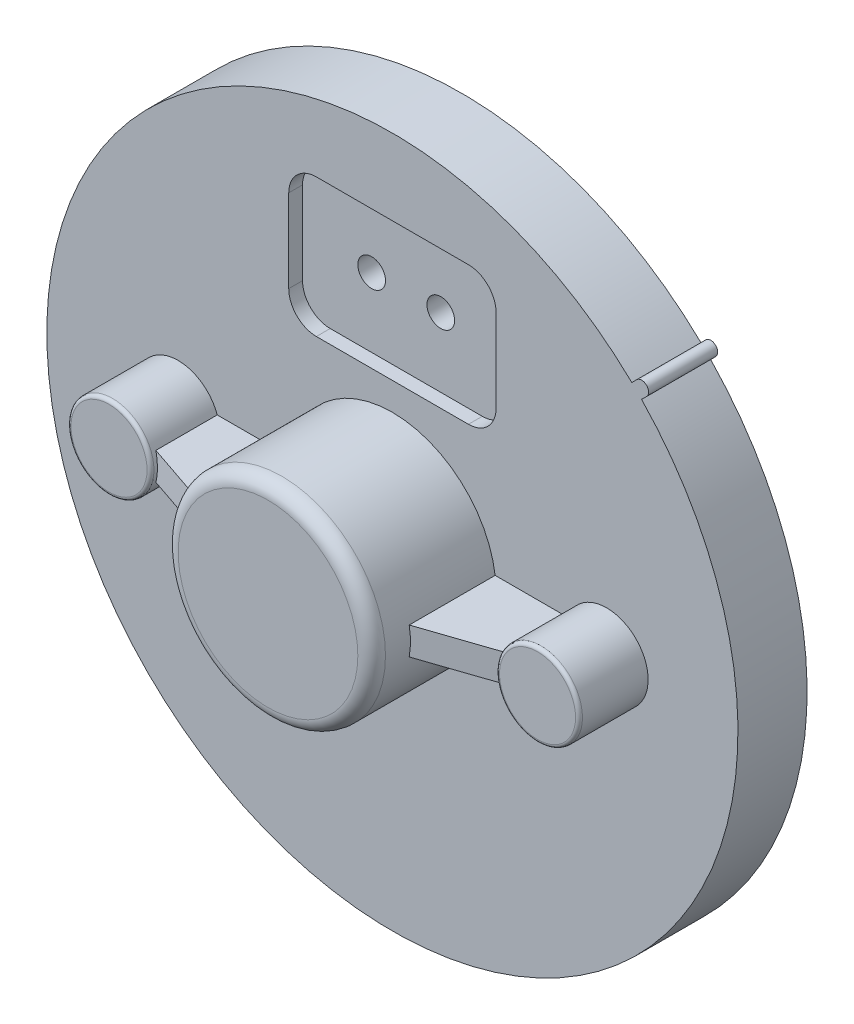
ISO-10303-21;
HEADER;
FILE_DESCRIPTION(('STEP AP214'),'2;1');
FILE_NAME('part.step','',(''),(''),'','','');
FILE_SCHEMA(('AUTOMOTIVE_DESIGN { 1 0 10303 214 1 1 1 1 }'));
ENDSEC;
DATA;
#1=APPLICATION_CONTEXT('core data for automotive mechanical design processes');
#2=APPLICATION_PROTOCOL_DEFINITION('international standard','automotive_design',2000,#1);
#3=PRODUCT_CONTEXT('',#1,'mechanical');
#4=PRODUCT('Part','Part','',(#3));
#5=PRODUCT_RELATED_PRODUCT_CATEGORY('part','',(#4));
#6=PRODUCT_DEFINITION_FORMATION('','',#4);
#7=PRODUCT_DEFINITION_CONTEXT('part definition',#1,'design');
#8=PRODUCT_DEFINITION('design','',#6,#7);
#9=PRODUCT_DEFINITION_SHAPE('','',#8);
#10=(LENGTH_UNIT() NAMED_UNIT(*) SI_UNIT(.MILLI.,.METRE.));
#11=(NAMED_UNIT(*) PLANE_ANGLE_UNIT() SI_UNIT($,.RADIAN.));
#12=(NAMED_UNIT(*) SI_UNIT($,.STERADIAN.) SOLID_ANGLE_UNIT());
#13=UNCERTAINTY_MEASURE_WITH_UNIT(LENGTH_MEASURE(1.E-05),#10,'distance_accuracy_value','');
#14=(GEOMETRIC_REPRESENTATION_CONTEXT(3) GLOBAL_UNCERTAINTY_ASSIGNED_CONTEXT((#13)) GLOBAL_UNIT_ASSIGNED_CONTEXT((#10,
#11,#12)) REPRESENTATION_CONTEXT('',''));
#15=CARTESIAN_POINT('',(0.,0.,0.));
#16=DIRECTION('',(0.,0.,1.));
#17=DIRECTION('',(1.,0.,0.));
#18=AXIS2_PLACEMENT_3D('',#15,#16,#17);
#19=CARTESIAN_POINT('',(0.,0.,5.));
#20=DIRECTION('',(0.,0.,-1.));
#21=DIRECTION('',(-1.,0.,0.));
#22=AXIS2_PLACEMENT_3D('',#19,#20,#21);
#23=CYLINDRICAL_SURFACE('',#22,25.);
#24=CARTESIAN_POINT('',(0.,0.,0.));
#25=DIRECTION('',(0.,0.,1.));
#26=DIRECTION('',(1.,0.,0.));
#27=AXIS2_PLACEMENT_3D('',#24,#25,#26);
#28=CIRCLE('',#27,25.);
#29=CARTESIAN_POINT('',(17.3205802515403,18.0276870327269,0.));
#30=VERTEX_POINT('',#29);
#31=CARTESIAN_POINT('',(18.0207749080859,17.3277716891729,0.));
#32=VERTEX_POINT('',#31);
#33=EDGE_CURVE('E312',#30,#32,#28,.T.);
#34=ORIENTED_EDGE('',*,*,#33,.T.);
#35=DIRECTION('',(0.,0.,-1.));
#36=VECTOR('',#35,1.);
#37=CARTESIAN_POINT('',(18.0207749080859,17.3277716891729,5.));
#38=LINE('',#37,#36);
#39=CARTESIAN_POINT('',(18.0207749080859,17.3277716891729,5.));
#40=VERTEX_POINT('',#39);
#41=EDGE_CURVE('E268',#32,#40,#38,.F.);
#42=ORIENTED_EDGE('',*,*,#41,.T.);
#43=CARTESIAN_POINT('',(0.,0.,5.));
#44=DIRECTION('',(0.,0.,1.));
#45=DIRECTION('',(1.,0.,0.));
#46=AXIS2_PLACEMENT_3D('',#43,#44,#45);
#47=CIRCLE('',#46,25.);
#48=CARTESIAN_POINT('',(17.3205802515403,18.0276870327269,5.));
#49=VERTEX_POINT('',#48);
#50=EDGE_CURVE('E58',#49,#40,#47,.T.);
#51=ORIENTED_EDGE('',*,*,#50,.F.);
#52=DIRECTION('',(0.,0.,-1.));
#53=VECTOR('',#52,1.);
#54=CARTESIAN_POINT('',(17.3205802515403,18.0276870327269,5.));
#55=LINE('',#54,#53);
#56=EDGE_CURVE('E266',#49,#30,#55,.T.);
#57=ORIENTED_EDGE('',*,*,#56,.T.);
#58=EDGE_LOOP('',(#34,#42,#51,#57));
#59=FACE_BOUND('',#58,.T.);
#60=ADVANCED_FACE('F34',(#59),#23,.T.);
#61=CARTESIAN_POINT('',(0.,0.,5.));
#62=DIRECTION('',(0.,0.,1.));
#63=DIRECTION('',(1.,0.,0.));
#64=AXIS2_PLACEMENT_3D('',#61,#62,#63);
#65=PLANE('',#64);
#66=CARTESIAN_POINT('',(5.5,11.5,5.));
#67=DIRECTION('',(0.,0.,1.));
#68=DIRECTION('',(1.,0.,0.));
#69=AXIS2_PLACEMENT_3D('',#66,#67,#68);
#70=CIRCLE('',#69,2.);
#71=CARTESIAN_POINT('',(5.49999999999999,9.5,5.));
#72=VERTEX_POINT('',#71);
#73=CARTESIAN_POINT('',(7.5,11.5,5.));
#74=VERTEX_POINT('',#73);
#75=EDGE_CURVE('E50',#72,#74,#70,.T.);
#76=ORIENTED_EDGE('',*,*,#75,.F.);
#77=DIRECTION('',(1.,0.,0.));
#78=VECTOR('',#77,1.);
#79=CARTESIAN_POINT('',(-5.49999999999999,9.5,5.));
#80=LINE('',#79,#78);
#81=CARTESIAN_POINT('',(-5.49999999999999,9.5,5.));
#82=VERTEX_POINT('',#81);
#83=EDGE_CURVE('E194',#82,#72,#80,.T.);
#84=ORIENTED_EDGE('',*,*,#83,.F.);
#85=CARTESIAN_POINT('',(-5.5,11.5,5.));
#86=DIRECTION('',(0.,0.,1.));
#87=DIRECTION('',(1.,0.,0.));
#88=AXIS2_PLACEMENT_3D('',#85,#86,#87);
#89=CIRCLE('',#88,2.);
#90=CARTESIAN_POINT('',(-7.5,11.5,5.));
#91=VERTEX_POINT('',#90);
#92=EDGE_CURVE('E197',#91,#82,#89,.T.);
#93=ORIENTED_EDGE('',*,*,#92,.F.);
#94=DIRECTION('',(0.,-1.,0.));
#95=VECTOR('',#94,1.);
#96=CARTESIAN_POINT('',(-7.5,17.5,5.));
#97=LINE('',#96,#95);
#98=CARTESIAN_POINT('',(-7.5,17.5,5.));
#99=VERTEX_POINT('',#98);
#100=EDGE_CURVE('E228',#99,#91,#97,.T.);
#101=ORIENTED_EDGE('',*,*,#100,.F.);
#102=CARTESIAN_POINT('',(-5.5,17.5,5.));
#103=DIRECTION('',(0.,0.,1.));
#104=DIRECTION('',(1.,0.,0.));
#105=AXIS2_PLACEMENT_3D('',#102,#103,#104);
#106=CIRCLE('',#105,2.);
#107=CARTESIAN_POINT('',(-5.49999999999999,19.5,5.));
#108=VERTEX_POINT('',#107);
#109=EDGE_CURVE('E225',#108,#99,#106,.T.);
#110=ORIENTED_EDGE('',*,*,#109,.F.);
#111=DIRECTION('',(-1.,0.,0.));
#112=VECTOR('',#111,1.);
#113=CARTESIAN_POINT('',(5.49999999999999,19.5,5.));
#114=LINE('',#113,#112);
#115=CARTESIAN_POINT('',(5.49999999999999,19.5,5.));
#116=VERTEX_POINT('',#115);
#117=EDGE_CURVE('E222',#116,#108,#114,.T.);
#118=ORIENTED_EDGE('',*,*,#117,.F.);
#119=CARTESIAN_POINT('',(5.5,17.5,5.));
#120=DIRECTION('',(0.,0.,1.));
#121=DIRECTION('',(1.,0.,0.));
#122=AXIS2_PLACEMENT_3D('',#119,#120,#121);
#123=CIRCLE('',#122,2.);
#124=CARTESIAN_POINT('',(7.5,17.5,5.));
#125=VERTEX_POINT('',#124);
#126=EDGE_CURVE('E219',#125,#116,#123,.T.);
#127=ORIENTED_EDGE('',*,*,#126,.F.);
#128=DIRECTION('',(0.,1.,0.));
#129=VECTOR('',#128,1.);
#130=CARTESIAN_POINT('',(7.5,11.5,5.));
#131=LINE('',#130,#129);
#132=EDGE_CURVE('E217',#74,#125,#131,.T.);
#133=ORIENTED_EDGE('',*,*,#132,.F.);
#134=EDGE_LOOP('',(#76,#84,#93,#101,#110,#118,#127,#133));
#135=FACE_BOUND('',#134,.T.);
#136=ORIENTED_EDGE('',*,*,#50,.T.);
#137=DIRECTION('',(0.721072035074011,0.692860101488189,0.));
#138=VECTOR('',#137,1.);
#139=CARTESIAN_POINT('',(17.7091763408607,17.0283644116613,5.));
#140=LINE('',#139,#138);
#141=CARTESIAN_POINT('',(18.377652971001,17.67068690272,5.));
#142=VERTEX_POINT('',#141);
#143=EDGE_CURVE('E259',#40,#142,#140,.T.);
#144=ORIENTED_EDGE('',*,*,#143,.T.);
#145=CARTESIAN_POINT('',(18.031222920257,18.031222920257,5.));
#146=DIRECTION('',(0.,0.,1.));
#147=DIRECTION('',(1.,0.,0.));
#148=AXIS2_PLACEMENT_3D('',#145,#146,#147);
#149=CIRCLE('',#148,0.499999999999976);
#150=CARTESIAN_POINT('',(17.6776695296637,18.3847763108502,5.));
#151=VERTEX_POINT('',#150);
#152=EDGE_CURVE('E235',#142,#151,#149,.T.);
#153=ORIENTED_EDGE('',*,*,#152,.T.);
#154=DIRECTION('',(-0.707106781186577,-0.707106781186518,0.));
#155=VECTOR('',#154,1.);
#156=CARTESIAN_POINT('',(17.6776695296637,18.3847763108502,5.));
#157=LINE('',#156,#155);
#158=EDGE_CURVE('E256',#151,#49,#157,.T.);
#159=ORIENTED_EDGE('',*,*,#158,.T.);
#160=EDGE_LOOP('',(#136,#144,#153,#159));
#161=FACE_BOUND('',#160,.T.);
#162=DIRECTION('',(-1.,0.,0.));
#163=VECTOR('',#162,1.);
#164=CARTESIAN_POINT('',(-15.8893034709787,-1.,5.));
#165=LINE('',#164,#163);
#166=CARTESIAN_POINT('',(-7.43303437365925,-1.,5.));
#167=VERTEX_POINT('',#166);
#168=CARTESIAN_POINT('',(-12.6715728752538,-1.,5.));
#169=VERTEX_POINT('',#168);
#170=EDGE_CURVE('E276',#167,#169,#165,.T.);
#171=ORIENTED_EDGE('',*,*,#170,.T.);
#172=CARTESIAN_POINT('',(-15.5,0.,5.));
#173=DIRECTION('',(0.,0.,1.));
#174=DIRECTION('',(1.,0.,0.));
#175=AXIS2_PLACEMENT_3D('',#172,#173,#174);
#176=CIRCLE('',#175,3.);
#177=CARTESIAN_POINT('',(-12.6715728752538,1.,5.));
#178=VERTEX_POINT('',#177);
#179=EDGE_CURVE('E309',#178,#169,#176,.T.);
#180=ORIENTED_EDGE('',*,*,#179,.F.);
#181=DIRECTION('',(-1.,0.,0.));
#182=VECTOR('',#181,1.);
#183=CARTESIAN_POINT('',(-15.8893034709787,1.,5.));
#184=LINE('',#183,#182);
#185=CARTESIAN_POINT('',(-7.43303437365925,1.,5.));
#186=VERTEX_POINT('',#185);
#187=EDGE_CURVE('E270',#186,#178,#184,.T.);
#188=ORIENTED_EDGE('',*,*,#187,.F.);
#189=CARTESIAN_POINT('',(0.,0.,5.));
#190=DIRECTION('',(0.,0.,1.));
#191=DIRECTION('',(1.,0.,0.));
#192=AXIS2_PLACEMENT_3D('',#189,#190,#191);
#193=CIRCLE('',#192,7.5);
#194=CARTESIAN_POINT('',(7.43303437365925,1.,5.));
#195=VERTEX_POINT('',#194);
#196=EDGE_CURVE('E313',#195,#186,#193,.T.);
#197=ORIENTED_EDGE('',*,*,#196,.F.);
#198=DIRECTION('',(-1.,0.,0.));
#199=VECTOR('',#198,1.);
#200=CARTESIAN_POINT('',(15.8893034709787,1.,4.99999999999999));
#201=LINE('',#200,#199);
#202=CARTESIAN_POINT('',(12.6715728752538,1.,4.99999999999999));
#203=VERTEX_POINT('',#202);
#204=EDGE_CURVE('E291',#203,#195,#201,.T.);
#205=ORIENTED_EDGE('',*,*,#204,.F.);
#206=CARTESIAN_POINT('',(15.5,0.,5.));
#207=DIRECTION('',(0.,0.,1.));
#208=DIRECTION('',(1.,0.,0.));
#209=AXIS2_PLACEMENT_3D('',#206,#207,#208);
#210=CIRCLE('',#209,3.);
#211=CARTESIAN_POINT('',(12.6715728752538,-1.,5.));
#212=VERTEX_POINT('',#211);
#213=EDGE_CURVE('E307',#212,#203,#210,.T.);
#214=ORIENTED_EDGE('',*,*,#213,.F.);
#215=DIRECTION('',(-1.,0.,0.));
#216=VECTOR('',#215,1.);
#217=CARTESIAN_POINT('',(15.8893034709787,-1.,4.99999999999999));
#218=LINE('',#217,#216);
#219=CARTESIAN_POINT('',(7.43303437365925,-1.,5.));
#220=VERTEX_POINT('',#219);
#221=EDGE_CURVE('E297',#212,#220,#218,.T.);
#222=ORIENTED_EDGE('',*,*,#221,.T.);
#223=EDGE_CURVE('E317',#167,#220,#193,.T.);
#224=ORIENTED_EDGE('',*,*,#223,.F.);
#225=EDGE_LOOP('',(#171,#180,#188,#197,#205,#214,#222,#224));
#226=FACE_BOUND('',#225,.T.);
#227=ADVANCED_FACE('F365',(#135,#161,#226),#65,.T.);
#228=CARTESIAN_POINT('',(0.,0.,0.));
#229=DIRECTION('',(0.,0.,1.));
#230=DIRECTION('',(1.,0.,0.));
#231=AXIS2_PLACEMENT_3D('',#228,#229,#230);
#232=PLANE('',#231);
#233=CARTESIAN_POINT('',(-2.5,14.5,0.));
#234=DIRECTION('',(0.,0.,1.));
#235=DIRECTION('',(1.,0.,0.));
#236=AXIS2_PLACEMENT_3D('',#233,#234,#235);
#237=CIRCLE('',#236,1.);
#238=CARTESIAN_POINT('',(-1.5,14.5,0.));
#239=VERTEX_POINT('',#238);
#240=EDGE_CURVE('E200',#239,#239,#237,.T.);
#241=ORIENTED_EDGE('',*,*,#240,.T.);
#242=EDGE_LOOP('',(#241));
#243=FACE_BOUND('',#242,.T.);
#244=CARTESIAN_POINT('',(2.5,14.5,0.));
#245=DIRECTION('',(0.,0.,1.));
#246=DIRECTION('',(1.,0.,0.));
#247=AXIS2_PLACEMENT_3D('',#244,#245,#246);
#248=CIRCLE('',#247,1.);
#249=CARTESIAN_POINT('',(3.5,14.5,0.));
#250=VERTEX_POINT('',#249);
#251=EDGE_CURVE('E38',#250,#250,#248,.T.);
#252=ORIENTED_EDGE('',*,*,#251,.T.);
#253=EDGE_LOOP('',(#252));
#254=FACE_BOUND('',#253,.T.);
#255=ORIENTED_EDGE('',*,*,#33,.F.);
#256=DIRECTION('',(0.707106781186577,0.707106781186518,0.));
#257=VECTOR('',#256,1.);
#258=CARTESIAN_POINT('',(17.6776695296637,18.3847763108502,0.));
#259=LINE('',#258,#257);
#260=CARTESIAN_POINT('',(17.6776695296637,18.3847763108502,0.));
#261=VERTEX_POINT('',#260);
#262=EDGE_CURVE('E253',#30,#261,#259,.T.);
#263=ORIENTED_EDGE('',*,*,#262,.T.);
#264=CARTESIAN_POINT('',(18.031222920257,18.031222920257,0.));
#265=DIRECTION('',(0.,0.,1.));
#266=DIRECTION('',(1.,0.,0.));
#267=AXIS2_PLACEMENT_3D('',#264,#265,#266);
#268=CIRCLE('',#267,0.499999999999976);
#269=CARTESIAN_POINT('',(18.377652971001,17.67068690272,0.));
#270=VERTEX_POINT('',#269);
#271=EDGE_CURVE('E250',#261,#270,#268,.F.);
#272=ORIENTED_EDGE('',*,*,#271,.T.);
#273=DIRECTION('',(-0.721072035074011,-0.69286010148819,0.));
#274=VECTOR('',#273,1.);
#275=CARTESIAN_POINT('',(17.7091763408607,17.0283644116613,0.));
#276=LINE('',#275,#274);
#277=EDGE_CURVE('E247',#270,#32,#276,.T.);
#278=ORIENTED_EDGE('',*,*,#277,.T.);
#279=EDGE_LOOP('',(#255,#263,#272,#278));
#280=FACE_BOUND('',#279,.T.);
#281=ADVANCED_FACE('F370',(#243,#254,#280),#232,.F.);
#282=CARTESIAN_POINT('',(0.,0.,14.));
#283=DIRECTION('',(0.,0.,-1.));
#284=DIRECTION('',(-1.,0.,0.));
#285=AXIS2_PLACEMENT_3D('',#282,#283,#284);
#286=CYLINDRICAL_SURFACE('',#285,7.5);
#287=CARTESIAN_POINT('',(0.,0.,13.));
#288=DIRECTION('',(0.,0.,1.));
#289=DIRECTION('',(1.,0.,0.));
#290=AXIS2_PLACEMENT_3D('',#287,#288,#289);
#291=CIRCLE('',#290,7.5);
#292=CARTESIAN_POINT('',(7.5,0.,13.));
#293=VERTEX_POINT('',#292);
#294=EDGE_CURVE('E322',#293,#293,#291,.F.);
#295=ORIENTED_EDGE('',*,*,#294,.T.);
#296=EDGE_LOOP('',(#295));
#297=FACE_BOUND('',#296,.T.);
#298=CARTESIAN_POINT('',(0.,0.,13.7385575730444));
#299=DIRECTION('',(-0.321125543599893,0.,0.947036633529914));
#300=DIRECTION('',(-0.947036633529914,0.,-0.321125543599893));
#301=AXIS2_PLACEMENT_3D('',#298,#299,#300);
#302=ELLIPSE('',#301,7.91944021430835,7.5);
#303=CARTESIAN_POINT('',(-7.43303437365925,1.,11.2181300422306));
#304=VERTEX_POINT('',#303);
#305=CARTESIAN_POINT('',(-7.43303437365925,-1.,11.2181300422306));
#306=VERTEX_POINT('',#305);
#307=EDGE_CURVE('E286',#304,#306,#302,.T.);
#308=ORIENTED_EDGE('',*,*,#307,.T.);
#309=DIRECTION('',(0.,0.,-1.));
#310=VECTOR('',#309,1.);
#311=CARTESIAN_POINT('',(-7.43303437365925,-1.,14.));
#312=LINE('',#311,#310);
#313=EDGE_CURVE('E284',#306,#167,#312,.T.);
#314=ORIENTED_EDGE('',*,*,#313,.T.);
#315=ORIENTED_EDGE('',*,*,#223,.T.);
#316=DIRECTION('',(0.,0.,-1.));
#317=VECTOR('',#316,1.);
#318=CARTESIAN_POINT('',(7.43303437365925,-1.,14.));
#319=LINE('',#318,#317);
#320=CARTESIAN_POINT('',(7.43303437365925,-1.,11.2181300422306));
#321=VERTEX_POINT('',#320);
#322=EDGE_CURVE('E303',#220,#321,#319,.F.);
#323=ORIENTED_EDGE('',*,*,#322,.T.);
#324=CARTESIAN_POINT('',(0.,0.,13.7385575730444));
#325=DIRECTION('',(0.321125543599893,0.,0.947036633529914));
#326=DIRECTION('',(0.947036633529914,0.,-0.321125543599893));
#327=AXIS2_PLACEMENT_3D('',#324,#325,#326);
#328=ELLIPSE('',#327,7.91944021430835,7.5);
#329=CARTESIAN_POINT('',(7.43303437365925,1.,11.2181300422306));
#330=VERTEX_POINT('',#329);
#331=EDGE_CURVE('E305',#321,#330,#328,.T.);
#332=ORIENTED_EDGE('',*,*,#331,.T.);
#333=DIRECTION('',(0.,0.,-1.));
#334=VECTOR('',#333,1.);
#335=CARTESIAN_POINT('',(7.43303437365925,1.,14.));
#336=LINE('',#335,#334);
#337=EDGE_CURVE('E300',#195,#330,#336,.F.);
#338=ORIENTED_EDGE('',*,*,#337,.F.);
#339=ORIENTED_EDGE('',*,*,#196,.T.);
#340=DIRECTION('',(0.,0.,-1.));
#341=VECTOR('',#340,1.);
#342=CARTESIAN_POINT('',(-7.43303437365925,1.,14.));
#343=LINE('',#342,#341);
#344=EDGE_CURVE('E281',#304,#186,#343,.T.);
#345=ORIENTED_EDGE('',*,*,#344,.F.);
#346=EDGE_LOOP('',(#308,#314,#315,#323,#332,#338,#339,#345));
#347=FACE_BOUND('',#346,.T.);
#348=ADVANCED_FACE('F395',(#297,#347),#286,.T.);
#349=CARTESIAN_POINT('',(0.,0.,14.));
#350=DIRECTION('',(0.,0.,1.));
#351=DIRECTION('',(1.,0.,0.));
#352=AXIS2_PLACEMENT_3D('',#349,#350,#351);
#353=PLANE('',#352);
#354=CARTESIAN_POINT('',(0.,0.,14.));
#355=DIRECTION('',(0.,0.,1.));
#356=DIRECTION('',(1.,0.,0.));
#357=AXIS2_PLACEMENT_3D('',#354,#355,#356);
#358=CIRCLE('',#357,6.5);
#359=CARTESIAN_POINT('',(6.5,0.,14.));
#360=VERTEX_POINT('',#359);
#361=EDGE_CURVE('E316',#360,#360,#358,.T.);
#362=ORIENTED_EDGE('',*,*,#361,.T.);
#363=EDGE_LOOP('',(#362));
#364=FACE_BOUND('',#363,.T.);
#365=ADVANCED_FACE('F392',(#364),#353,.T.);
#366=CARTESIAN_POINT('',(-15.5,0.,10.));
#367=DIRECTION('',(0.,0.,-1.));
#368=DIRECTION('',(-1.,0.,0.));
#369=AXIS2_PLACEMENT_3D('',#366,#367,#368);
#370=CYLINDRICAL_SURFACE('',#369,3.);
#371=CARTESIAN_POINT('',(-15.5,0.,9.75));
#372=DIRECTION('',(0.,0.,1.));
#373=DIRECTION('',(1.,0.,0.));
#374=AXIS2_PLACEMENT_3D('',#371,#372,#373);
#375=CIRCLE('',#374,3.);
#376=CARTESIAN_POINT('',(-12.5,0.,9.75));
#377=VERTEX_POINT('',#376);
#378=EDGE_CURVE('E342',#377,#377,#375,.F.);
#379=ORIENTED_EDGE('',*,*,#378,.T.);
#380=EDGE_LOOP('',(#379));
#381=FACE_BOUND('',#380,.T.);
#382=ORIENTED_EDGE('',*,*,#179,.T.);
#383=DIRECTION('',(0.,0.,-1.));
#384=VECTOR('',#383,1.);
#385=CARTESIAN_POINT('',(-12.6715728752538,-1.,10.));
#386=LINE('',#385,#384);
#387=CARTESIAN_POINT('',(-12.6715728752538,-1.,9.44182227922112));
#388=VERTEX_POINT('',#387);
#389=EDGE_CURVE('E337',#169,#388,#386,.F.);
#390=ORIENTED_EDGE('',*,*,#389,.T.);
#391=CARTESIAN_POINT('',(-15.5,0.,8.48274618246935));
#392=DIRECTION('',(-0.321125543599893,0.,0.947036633529914));
#393=DIRECTION('',(-0.947036633529914,0.,-0.321125543599893));
#394=AXIS2_PLACEMENT_3D('',#391,#392,#393);
#395=ELLIPSE('',#394,3.16777608572334,3.);
#396=CARTESIAN_POINT('',(-12.6715728752538,1.,9.44182227922112));
#397=VERTEX_POINT('',#396);
#398=EDGE_CURVE('E335',#388,#397,#395,.T.);
#399=ORIENTED_EDGE('',*,*,#398,.T.);
#400=DIRECTION('',(0.,0.,-1.));
#401=VECTOR('',#400,1.);
#402=CARTESIAN_POINT('',(-12.6715728752538,1.,10.));
#403=LINE('',#402,#401);
#404=EDGE_CURVE('E332',#178,#397,#403,.F.);
#405=ORIENTED_EDGE('',*,*,#404,.F.);
#406=EDGE_LOOP('',(#382,#390,#399,#405));
#407=FACE_BOUND('',#406,.T.);
#408=ADVANCED_FACE('F394',(#381,#407),#370,.T.);
#409=CARTESIAN_POINT('',(-15.5,0.,10.));
#410=DIRECTION('',(0.,0.,1.));
#411=DIRECTION('',(1.,0.,0.));
#412=AXIS2_PLACEMENT_3D('',#409,#410,#411);
#413=PLANE('',#412);
#414=CARTESIAN_POINT('',(-15.5,0.,10.));
#415=DIRECTION('',(0.,0.,1.));
#416=DIRECTION('',(1.,0.,0.));
#417=AXIS2_PLACEMENT_3D('',#414,#415,#416);
#418=CIRCLE('',#417,2.75);
#419=CARTESIAN_POINT('',(-12.75,0.,10.));
#420=VERTEX_POINT('',#419);
#421=EDGE_CURVE('E339',#420,#420,#418,.T.);
#422=ORIENTED_EDGE('',*,*,#421,.T.);
#423=EDGE_LOOP('',(#422));
#424=FACE_BOUND('',#423,.T.);
#425=ADVANCED_FACE('F401',(#424),#413,.T.);
#426=CARTESIAN_POINT('',(15.5,0.,10.));
#427=DIRECTION('',(0.,0.,-1.));
#428=DIRECTION('',(-1.,0.,0.));
#429=AXIS2_PLACEMENT_3D('',#426,#427,#428);
#430=CYLINDRICAL_SURFACE('',#429,3.);
#431=CARTESIAN_POINT('',(15.5,0.,9.75));
#432=DIRECTION('',(0.,0.,1.));
#433=DIRECTION('',(1.,0.,0.));
#434=AXIS2_PLACEMENT_3D('',#431,#432,#433);
#435=CIRCLE('',#434,3.);
#436=CARTESIAN_POINT('',(18.5,0.,9.75));
#437=VERTEX_POINT('',#436);
#438=EDGE_CURVE('E11',#437,#437,#435,.F.);
#439=ORIENTED_EDGE('',*,*,#438,.T.);
#440=EDGE_LOOP('',(#439));
#441=FACE_BOUND('',#440,.T.);
#442=CARTESIAN_POINT('',(15.5,0.,8.48274618246935));
#443=DIRECTION('',(0.321125543599893,0.,0.947036633529914));
#444=DIRECTION('',(0.947036633529914,0.,-0.321125543599893));
#445=AXIS2_PLACEMENT_3D('',#442,#443,#444);
#446=ELLIPSE('',#445,3.16777608572334,3.);
#447=CARTESIAN_POINT('',(12.6715728752538,1.,9.44182227922111));
#448=VERTEX_POINT('',#447);
#449=CARTESIAN_POINT('',(12.6715728752538,-1.,9.44182227922111));
#450=VERTEX_POINT('',#449);
#451=EDGE_CURVE('E328',#448,#450,#446,.T.);
#452=ORIENTED_EDGE('',*,*,#451,.T.);
#453=DIRECTION('',(0.,0.,-1.));
#454=VECTOR('',#453,1.);
#455=CARTESIAN_POINT('',(12.6715728752538,-1.,10.));
#456=LINE('',#455,#454);
#457=EDGE_CURVE('E330',#450,#212,#456,.T.);
#458=ORIENTED_EDGE('',*,*,#457,.T.);
#459=ORIENTED_EDGE('',*,*,#213,.T.);
#460=DIRECTION('',(0.,0.,-1.));
#461=VECTOR('',#460,1.);
#462=CARTESIAN_POINT('',(12.6715728752538,1.,10.));
#463=LINE('',#462,#461);
#464=EDGE_CURVE('E325',#448,#203,#463,.T.);
#465=ORIENTED_EDGE('',*,*,#464,.F.);
#466=EDGE_LOOP('',(#452,#458,#459,#465));
#467=FACE_BOUND('',#466,.T.);
#468=ADVANCED_FACE('F386',(#441,#467),#430,.T.);
#469=CARTESIAN_POINT('',(15.5,0.,10.));
#470=DIRECTION('',(0.,0.,1.));
#471=DIRECTION('',(1.,0.,0.));
#472=AXIS2_PLACEMENT_3D('',#469,#470,#471);
#473=PLANE('',#472);
#474=CARTESIAN_POINT('',(15.5,0.,10.));
#475=DIRECTION('',(0.,0.,1.));
#476=DIRECTION('',(1.,0.,0.));
#477=AXIS2_PLACEMENT_3D('',#474,#475,#476);
#478=CIRCLE('',#477,2.75);
#479=CARTESIAN_POINT('',(18.25,0.,10.));
#480=VERTEX_POINT('',#479);
#481=EDGE_CURVE('E43',#480,#480,#478,.T.);
#482=ORIENTED_EDGE('',*,*,#481,.T.);
#483=EDGE_LOOP('',(#482));
#484=FACE_BOUND('',#483,.T.);
#485=ADVANCED_FACE('F348',(#484),#473,.T.);
#486=CARTESIAN_POINT('',(0.,0.,13.));
#487=DIRECTION('',(0.,0.,1.));
#488=DIRECTION('',(1.,0.,0.));
#489=AXIS2_PLACEMENT_3D('',#486,#487,#488);
#490=TOROIDAL_SURFACE('',#489,6.5,1.);
#491=ORIENTED_EDGE('',*,*,#294,.F.);
#492=EDGE_LOOP('',(#491));
#493=FACE_BOUND('',#492,.T.);
#494=ORIENTED_EDGE('',*,*,#361,.F.);
#495=EDGE_LOOP('',(#494));
#496=FACE_BOUND('',#495,.T.);
#497=ADVANCED_FACE('F375',(#493,#496),#490,.T.);
#498=CARTESIAN_POINT('',(0.,-1.,0.));
#499=DIRECTION('',(0.,-1.,0.));
#500=DIRECTION('',(0.,0.,-1.));
#501=AXIS2_PLACEMENT_3D('',#498,#499,#500);
#502=PLANE('',#501);
#503=ORIENTED_EDGE('',*,*,#322,.F.);
#504=ORIENTED_EDGE('',*,*,#221,.F.);
#505=ORIENTED_EDGE('',*,*,#457,.F.);
#506=DIRECTION('',(0.947036633529914,0.,-0.321125543599893));
#507=VECTOR('',#506,1.);
#508=CARTESIAN_POINT('',(15.8893034709787,-1.,8.350739368459));
#509=LINE('',#508,#507);
#510=EDGE_CURVE('E294',#321,#450,#509,.T.);
#511=ORIENTED_EDGE('',*,*,#510,.F.);
#512=EDGE_LOOP('',(#503,#504,#505,#511));
#513=FACE_BOUND('',#512,.T.);
#514=ADVANCED_FACE('F377',(#513),#502,.T.);
#515=CARTESIAN_POINT('',(0.,1.,0.));
#516=DIRECTION('',(0.,-1.,0.));
#517=DIRECTION('',(0.,0.,-1.));
#518=AXIS2_PLACEMENT_3D('',#515,#516,#517);
#519=PLANE('',#518);
#520=ORIENTED_EDGE('',*,*,#204,.T.);
#521=ORIENTED_EDGE('',*,*,#337,.T.);
#522=DIRECTION('',(0.947036633529914,0.,-0.321125543599893));
#523=VECTOR('',#522,1.);
#524=CARTESIAN_POINT('',(15.8893034709787,1.,8.350739368459));
#525=LINE('',#524,#523);
#526=EDGE_CURVE('E288',#330,#448,#525,.T.);
#527=ORIENTED_EDGE('',*,*,#526,.T.);
#528=ORIENTED_EDGE('',*,*,#464,.T.);
#529=EDGE_LOOP('',(#520,#521,#527,#528));
#530=FACE_BOUND('',#529,.T.);
#531=ADVANCED_FACE('F383',(#530),#519,.F.);
#532=CARTESIAN_POINT('',(15.8893034709787,-1.,8.350739368459));
#533=DIRECTION('',(0.321125543599893,0.,0.947036633529914));
#534=DIRECTION('',(0.947036633529914,0.,-0.321125543599893));
#535=AXIS2_PLACEMENT_3D('',#532,#533,#534);
#536=PLANE('',#535);
#537=ORIENTED_EDGE('',*,*,#331,.F.);
#538=ORIENTED_EDGE('',*,*,#510,.T.);
#539=ORIENTED_EDGE('',*,*,#451,.F.);
#540=ORIENTED_EDGE('',*,*,#526,.F.);
#541=EDGE_LOOP('',(#537,#538,#539,#540));
#542=FACE_BOUND('',#541,.T.);
#543=ADVANCED_FACE('F413',(#542),#536,.T.);
#544=CARTESIAN_POINT('',(0.,-1.,0.));
#545=DIRECTION('',(0.,-1.,0.));
#546=DIRECTION('',(0.,0.,-1.));
#547=AXIS2_PLACEMENT_3D('',#544,#545,#546);
#548=PLANE('',#547);
#549=ORIENTED_EDGE('',*,*,#313,.F.);
#550=DIRECTION('',(0.947036633529914,0.,0.321125543599893));
#551=VECTOR('',#550,1.);
#552=CARTESIAN_POINT('',(-15.8893034709787,-1.,8.35073936845901));
#553=LINE('',#552,#551);
#554=EDGE_CURVE('E278',#388,#306,#553,.T.);
#555=ORIENTED_EDGE('',*,*,#554,.F.);
#556=ORIENTED_EDGE('',*,*,#389,.F.);
#557=ORIENTED_EDGE('',*,*,#170,.F.);
#558=EDGE_LOOP('',(#549,#555,#556,#557));
#559=FACE_BOUND('',#558,.T.);
#560=ADVANCED_FACE('F415',(#559),#548,.T.);
#561=CARTESIAN_POINT('',(0.,1.,0.));
#562=DIRECTION('',(0.,-1.,0.));
#563=DIRECTION('',(0.,0.,-1.));
#564=AXIS2_PLACEMENT_3D('',#561,#562,#563);
#565=PLANE('',#564);
#566=DIRECTION('',(0.947036633529914,0.,0.321125543599893));
#567=VECTOR('',#566,1.);
#568=CARTESIAN_POINT('',(-15.8893034709787,1.,8.35073936845901));
#569=LINE('',#568,#567);
#570=EDGE_CURVE('E273',#397,#304,#569,.T.);
#571=ORIENTED_EDGE('',*,*,#570,.T.);
#572=ORIENTED_EDGE('',*,*,#344,.T.);
#573=ORIENTED_EDGE('',*,*,#187,.T.);
#574=ORIENTED_EDGE('',*,*,#404,.T.);
#575=EDGE_LOOP('',(#571,#572,#573,#574));
#576=FACE_BOUND('',#575,.T.);
#577=ADVANCED_FACE('F423',(#576),#565,.F.);
#578=CARTESIAN_POINT('',(-15.8893034709787,-1.,8.35073936845901));
#579=DIRECTION('',(-0.321125543599893,0.,0.947036633529914));
#580=DIRECTION('',(0.947036633529914,0.,0.321125543599893));
#581=AXIS2_PLACEMENT_3D('',#578,#579,#580);
#582=PLANE('',#581);
#583=ORIENTED_EDGE('',*,*,#307,.F.);
#584=ORIENTED_EDGE('',*,*,#570,.F.);
#585=ORIENTED_EDGE('',*,*,#398,.F.);
#586=ORIENTED_EDGE('',*,*,#554,.T.);
#587=EDGE_LOOP('',(#583,#584,#585,#586));
#588=FACE_BOUND('',#587,.T.);
#589=ADVANCED_FACE('F361',(#588),#582,.T.);
#590=CARTESIAN_POINT('',(-15.5,0.,9.75));
#591=DIRECTION('',(0.,0.,1.));
#592=DIRECTION('',(1.,0.,0.));
#593=AXIS2_PLACEMENT_3D('',#590,#591,#592);
#594=TOROIDAL_SURFACE('',#593,2.75,0.25);
#595=ORIENTED_EDGE('',*,*,#378,.F.);
#596=EDGE_LOOP('',(#595));
#597=FACE_BOUND('',#596,.T.);
#598=ORIENTED_EDGE('',*,*,#421,.F.);
#599=EDGE_LOOP('',(#598));
#600=FACE_BOUND('',#599,.T.);
#601=ADVANCED_FACE('F352',(#597,#600),#594,.T.);
#602=CARTESIAN_POINT('',(15.5,0.,9.75));
#603=DIRECTION('',(0.,0.,1.));
#604=DIRECTION('',(1.,0.,0.));
#605=AXIS2_PLACEMENT_3D('',#602,#603,#604);
#606=TOROIDAL_SURFACE('',#605,2.75,0.25);
#607=ORIENTED_EDGE('',*,*,#438,.F.);
#608=EDGE_LOOP('',(#607));
#609=FACE_BOUND('',#608,.T.);
#610=ORIENTED_EDGE('',*,*,#481,.F.);
#611=EDGE_LOOP('',(#610));
#612=FACE_BOUND('',#611,.T.);
#613=ADVANCED_FACE('F36',(#609,#612),#606,.T.);
#614=CARTESIAN_POINT('',(17.7091763408607,17.0283644116613,-2.13467976300144));
#615=DIRECTION('',(0.69286010148819,-0.721072035074011,0.));
#616=DIRECTION('',(0.721072035074011,0.69286010148819,0.));
#617=AXIS2_PLACEMENT_3D('',#614,#615,#616);
#618=PLANE('',#617);
#619=ORIENTED_EDGE('',*,*,#41,.F.);
#620=ORIENTED_EDGE('',*,*,#277,.F.);
#621=DIRECTION('',(0.,0.,1.));
#622=VECTOR('',#621,1.);
#623=CARTESIAN_POINT('',(18.377652971001,17.67068690272,-2.13467976300144));
#624=LINE('',#623,#622);
#625=EDGE_CURVE('E251',#270,#142,#624,.T.);
#626=ORIENTED_EDGE('',*,*,#625,.T.);
#627=ORIENTED_EDGE('',*,*,#143,.F.);
#628=EDGE_LOOP('',(#619,#620,#626,#627));
#629=FACE_BOUND('',#628,.T.);
#630=ADVANCED_FACE('F351',(#629),#618,.T.);
#631=CARTESIAN_POINT('',(17.6776695296637,18.3847763108502,-2.13467976300144));
#632=DIRECTION('',(-0.707106781186518,0.707106781186577,0.));
#633=DIRECTION('',(-0.707106781186577,-0.707106781186518,0.));
#634=AXIS2_PLACEMENT_3D('',#631,#632,#633);
#635=PLANE('',#634);
#636=ORIENTED_EDGE('',*,*,#56,.F.);
#637=ORIENTED_EDGE('',*,*,#158,.F.);
#638=DIRECTION('',(0.,0.,1.));
#639=VECTOR('',#638,1.);
#640=CARTESIAN_POINT('',(17.6776695296637,18.3847763108502,-2.13467976300144));
#641=LINE('',#640,#639);
#642=EDGE_CURVE('E261',#261,#151,#641,.T.);
#643=ORIENTED_EDGE('',*,*,#642,.F.);
#644=ORIENTED_EDGE('',*,*,#262,.F.);
#645=EDGE_LOOP('',(#636,#637,#643,#644));
#646=FACE_BOUND('',#645,.T.);
#647=ADVANCED_FACE('F358',(#646),#635,.T.);
#648=CARTESIAN_POINT('',(18.031222920257,18.031222920257,-2.13467976300144));
#649=DIRECTION('',(0.,0.,1.));
#650=DIRECTION('',(1.,0.,0.));
#651=AXIS2_PLACEMENT_3D('',#648,#649,#650);
#652=CYLINDRICAL_SURFACE('',#651,0.499999999999976);
#653=ORIENTED_EDGE('',*,*,#271,.F.);
#654=ORIENTED_EDGE('',*,*,#642,.T.);
#655=ORIENTED_EDGE('',*,*,#152,.F.);
#656=ORIENTED_EDGE('',*,*,#625,.F.);
#657=EDGE_LOOP('',(#653,#654,#655,#656));
#658=FACE_BOUND('',#657,.T.);
#659=ADVANCED_FACE('F431',(#658),#652,.T.);
#660=CARTESIAN_POINT('',(5.5,11.5,4.));
#661=DIRECTION('',(0.,0.,1.));
#662=DIRECTION('',(1.,0.,0.));
#663=AXIS2_PLACEMENT_3D('',#660,#661,#662);
#664=CYLINDRICAL_SURFACE('',#663,2.);
#665=ORIENTED_EDGE('',*,*,#75,.T.);
#666=DIRECTION('',(0.,0.,1.));
#667=VECTOR('',#666,1.);
#668=CARTESIAN_POINT('',(7.5,11.5,4.));
#669=LINE('',#668,#667);
#670=CARTESIAN_POINT('',(7.5,11.5,4.));
#671=VERTEX_POINT('',#670);
#672=EDGE_CURVE('E171',#671,#74,#669,.T.);
#673=ORIENTED_EDGE('',*,*,#672,.F.);
#674=CARTESIAN_POINT('',(5.5,11.5,4.));
#675=DIRECTION('',(0.,0.,1.));
#676=DIRECTION('',(1.,0.,0.));
#677=AXIS2_PLACEMENT_3D('',#674,#675,#676);
#678=CIRCLE('',#677,2.);
#679=CARTESIAN_POINT('',(5.49999999999999,9.5,4.));
#680=VERTEX_POINT('',#679);
#681=EDGE_CURVE('E175',#680,#671,#678,.T.);
#682=ORIENTED_EDGE('',*,*,#681,.F.);
#683=DIRECTION('',(0.,0.,1.));
#684=VECTOR('',#683,1.);
#685=CARTESIAN_POINT('',(5.49999999999999,9.5,4.));
#686=LINE('',#685,#684);
#687=EDGE_CURVE('E233',#680,#72,#686,.T.);
#688=ORIENTED_EDGE('',*,*,#687,.T.);
#689=EDGE_LOOP('',(#665,#673,#682,#688));
#690=FACE_BOUND('',#689,.T.);
#691=ADVANCED_FACE('F173',(#690),#664,.F.);
#692=CARTESIAN_POINT('',(-5.49999999999999,9.5,4.));
#693=DIRECTION('',(0.,-1.,0.));
#694=DIRECTION('',(0.,0.,-1.));
#695=AXIS2_PLACEMENT_3D('',#692,#693,#694);
#696=PLANE('',#695);
#697=ORIENTED_EDGE('',*,*,#83,.T.);
#698=ORIENTED_EDGE('',*,*,#687,.F.);
#699=DIRECTION('',(1.,0.,0.));
#700=VECTOR('',#699,1.);
#701=CARTESIAN_POINT('',(-5.49999999999999,9.5,4.));
#702=LINE('',#701,#700);
#703=CARTESIAN_POINT('',(-5.49999999999999,9.5,4.));
#704=VERTEX_POINT('',#703);
#705=EDGE_CURVE('E181',#704,#680,#702,.T.);
#706=ORIENTED_EDGE('',*,*,#705,.F.);
#707=DIRECTION('',(0.,0.,1.));
#708=VECTOR('',#707,1.);
#709=CARTESIAN_POINT('',(-5.49999999999999,9.5,4.));
#710=LINE('',#709,#708);
#711=EDGE_CURVE('E236',#704,#82,#710,.T.);
#712=ORIENTED_EDGE('',*,*,#711,.T.);
#713=EDGE_LOOP('',(#697,#698,#706,#712));
#714=FACE_BOUND('',#713,.T.);
#715=ADVANCED_FACE('F440',(#714),#696,.F.);
#716=CARTESIAN_POINT('',(-5.5,11.5,4.));
#717=DIRECTION('',(0.,0.,1.));
#718=DIRECTION('',(1.,0.,0.));
#719=AXIS2_PLACEMENT_3D('',#716,#717,#718);
#720=CYLINDRICAL_SURFACE('',#719,2.);
#721=ORIENTED_EDGE('',*,*,#92,.T.);
#722=ORIENTED_EDGE('',*,*,#711,.F.);
#723=CARTESIAN_POINT('',(-5.5,11.5,4.));
#724=DIRECTION('',(0.,0.,1.));
#725=DIRECTION('',(1.,0.,0.));
#726=AXIS2_PLACEMENT_3D('',#723,#724,#725);
#727=CIRCLE('',#726,2.);
#728=CARTESIAN_POINT('',(-7.5,11.5,4.));
#729=VERTEX_POINT('',#728);
#730=EDGE_CURVE('E213',#729,#704,#727,.T.);
#731=ORIENTED_EDGE('',*,*,#730,.F.);
#732=DIRECTION('',(0.,0.,1.));
#733=VECTOR('',#732,1.);
#734=CARTESIAN_POINT('',(-7.5,11.5,4.));
#735=LINE('',#734,#733);
#736=EDGE_CURVE('E238',#729,#91,#735,.T.);
#737=ORIENTED_EDGE('',*,*,#736,.T.);
#738=EDGE_LOOP('',(#721,#722,#731,#737));
#739=FACE_BOUND('',#738,.T.);
#740=ADVANCED_FACE('F458',(#739),#720,.F.);
#741=CARTESIAN_POINT('',(-7.5,17.5,4.));
#742=DIRECTION('',(-1.,0.,0.));
#743=DIRECTION('',(0.,0.,1.));
#744=AXIS2_PLACEMENT_3D('',#741,#742,#743);
#745=PLANE('',#744);
#746=ORIENTED_EDGE('',*,*,#100,.T.);
#747=ORIENTED_EDGE('',*,*,#736,.F.);
#748=DIRECTION('',(0.,-1.,0.));
#749=VECTOR('',#748,1.);
#750=CARTESIAN_POINT('',(-7.5,17.5,4.));
#751=LINE('',#750,#749);
#752=CARTESIAN_POINT('',(-7.5,17.5,4.));
#753=VERTEX_POINT('',#752);
#754=EDGE_CURVE('E210',#753,#729,#751,.T.);
#755=ORIENTED_EDGE('',*,*,#754,.F.);
#756=DIRECTION('',(0.,0.,1.));
#757=VECTOR('',#756,1.);
#758=CARTESIAN_POINT('',(-7.5,17.5,4.));
#759=LINE('',#758,#757);
#760=EDGE_CURVE('E240',#753,#99,#759,.T.);
#761=ORIENTED_EDGE('',*,*,#760,.T.);
#762=EDGE_LOOP('',(#746,#747,#755,#761));
#763=FACE_BOUND('',#762,.T.);
#764=ADVANCED_FACE('F454',(#763),#745,.F.);
#765=CARTESIAN_POINT('',(-5.5,17.5,4.));
#766=DIRECTION('',(0.,0.,1.));
#767=DIRECTION('',(1.,0.,0.));
#768=AXIS2_PLACEMENT_3D('',#765,#766,#767);
#769=CYLINDRICAL_SURFACE('',#768,2.);
#770=ORIENTED_EDGE('',*,*,#109,.T.);
#771=ORIENTED_EDGE('',*,*,#760,.F.);
#772=CARTESIAN_POINT('',(-5.5,17.5,4.));
#773=DIRECTION('',(0.,0.,1.));
#774=DIRECTION('',(1.,0.,0.));
#775=AXIS2_PLACEMENT_3D('',#772,#773,#774);
#776=CIRCLE('',#775,2.);
#777=CARTESIAN_POINT('',(-5.49999999999999,19.5,4.));
#778=VERTEX_POINT('',#777);
#779=EDGE_CURVE('E207',#778,#753,#776,.T.);
#780=ORIENTED_EDGE('',*,*,#779,.F.);
#781=DIRECTION('',(0.,0.,1.));
#782=VECTOR('',#781,1.);
#783=CARTESIAN_POINT('',(-5.49999999999999,19.5,4.));
#784=LINE('',#783,#782);
#785=EDGE_CURVE('E242',#778,#108,#784,.T.);
#786=ORIENTED_EDGE('',*,*,#785,.T.);
#787=EDGE_LOOP('',(#770,#771,#780,#786));
#788=FACE_BOUND('',#787,.T.);
#789=ADVANCED_FACE('F450',(#788),#769,.F.);
#790=CARTESIAN_POINT('',(5.49999999999999,19.5,4.));
#791=DIRECTION('',(0.,1.,0.));
#792=DIRECTION('',(0.,0.,1.));
#793=AXIS2_PLACEMENT_3D('',#790,#791,#792);
#794=PLANE('',#793);
#795=ORIENTED_EDGE('',*,*,#117,.T.);
#796=ORIENTED_EDGE('',*,*,#785,.F.);
#797=DIRECTION('',(-1.,0.,0.));
#798=VECTOR('',#797,1.);
#799=CARTESIAN_POINT('',(5.49999999999999,19.5,4.));
#800=LINE('',#799,#798);
#801=CARTESIAN_POINT('',(5.49999999999999,19.5,4.));
#802=VERTEX_POINT('',#801);
#803=EDGE_CURVE('E204',#802,#778,#800,.T.);
#804=ORIENTED_EDGE('',*,*,#803,.F.);
#805=DIRECTION('',(0.,0.,1.));
#806=VECTOR('',#805,1.);
#807=CARTESIAN_POINT('',(5.49999999999999,19.5,4.));
#808=LINE('',#807,#806);
#809=EDGE_CURVE('E244',#802,#116,#808,.T.);
#810=ORIENTED_EDGE('',*,*,#809,.T.);
#811=EDGE_LOOP('',(#795,#796,#804,#810));
#812=FACE_BOUND('',#811,.T.);
#813=ADVANCED_FACE('F446',(#812),#794,.F.);
#814=CARTESIAN_POINT('',(5.5,17.5,4.));
#815=DIRECTION('',(0.,0.,1.));
#816=DIRECTION('',(1.,0.,0.));
#817=AXIS2_PLACEMENT_3D('',#814,#815,#816);
#818=CYLINDRICAL_SURFACE('',#817,2.);
#819=ORIENTED_EDGE('',*,*,#126,.T.);
#820=ORIENTED_EDGE('',*,*,#809,.F.);
#821=CARTESIAN_POINT('',(5.5,17.5,4.));
#822=DIRECTION('',(0.,0.,1.));
#823=DIRECTION('',(1.,0.,0.));
#824=AXIS2_PLACEMENT_3D('',#821,#822,#823);
#825=CIRCLE('',#824,2.);
#826=CARTESIAN_POINT('',(7.5,17.5,4.));
#827=VERTEX_POINT('',#826);
#828=EDGE_CURVE('E189',#827,#802,#825,.T.);
#829=ORIENTED_EDGE('',*,*,#828,.F.);
#830=DIRECTION('',(0.,0.,1.));
#831=VECTOR('',#830,1.);
#832=CARTESIAN_POINT('',(7.5,17.5,4.));
#833=LINE('',#832,#831);
#834=EDGE_CURVE('E180',#827,#125,#833,.T.);
#835=ORIENTED_EDGE('',*,*,#834,.T.);
#836=EDGE_LOOP('',(#819,#820,#829,#835));
#837=FACE_BOUND('',#836,.T.);
#838=ADVANCED_FACE('F443',(#837),#818,.F.);
#839=CARTESIAN_POINT('',(7.5,11.5,4.));
#840=DIRECTION('',(1.,0.,0.));
#841=DIRECTION('',(0.,0.,-1.));
#842=AXIS2_PLACEMENT_3D('',#839,#840,#841);
#843=PLANE('',#842);
#844=ORIENTED_EDGE('',*,*,#132,.T.);
#845=ORIENTED_EDGE('',*,*,#834,.F.);
#846=DIRECTION('',(0.,1.,0.));
#847=VECTOR('',#846,1.);
#848=CARTESIAN_POINT('',(7.5,11.5,4.));
#849=LINE('',#848,#847);
#850=EDGE_CURVE('E184',#671,#827,#849,.T.);
#851=ORIENTED_EDGE('',*,*,#850,.F.);
#852=ORIENTED_EDGE('',*,*,#672,.T.);
#853=EDGE_LOOP('',(#844,#845,#851,#852));
#854=FACE_BOUND('',#853,.T.);
#855=ADVANCED_FACE('F185',(#854),#843,.F.);
#856=CARTESIAN_POINT('',(5.5,11.5,4.));
#857=DIRECTION('',(0.,0.,1.));
#858=DIRECTION('',(1.,0.,0.));
#859=AXIS2_PLACEMENT_3D('',#856,#857,#858);
#860=PLANE('',#859);
#861=CARTESIAN_POINT('',(2.5,14.5,4.));
#862=DIRECTION('',(0.,0.,1.));
#863=DIRECTION('',(1.,0.,0.));
#864=AXIS2_PLACEMENT_3D('',#861,#862,#863);
#865=CIRCLE('',#864,1.);
#866=CARTESIAN_POINT('',(3.5,14.5,4.));
#867=VERTEX_POINT('',#866);
#868=EDGE_CURVE('E486',#867,#867,#865,.T.);
#869=ORIENTED_EDGE('',*,*,#868,.F.);
#870=EDGE_LOOP('',(#869));
#871=FACE_BOUND('',#870,.T.);
#872=CARTESIAN_POINT('',(-2.5,14.5,4.));
#873=DIRECTION('',(0.,0.,1.));
#874=DIRECTION('',(1.,0.,0.));
#875=AXIS2_PLACEMENT_3D('',#872,#873,#874);
#876=CIRCLE('',#875,1.);
#877=CARTESIAN_POINT('',(-1.5,14.5,4.));
#878=VERTEX_POINT('',#877);
#879=EDGE_CURVE('E481',#878,#878,#876,.T.);
#880=ORIENTED_EDGE('',*,*,#879,.F.);
#881=EDGE_LOOP('',(#880));
#882=FACE_BOUND('',#881,.T.);
#883=ORIENTED_EDGE('',*,*,#681,.T.);
#884=ORIENTED_EDGE('',*,*,#850,.T.);
#885=ORIENTED_EDGE('',*,*,#828,.T.);
#886=ORIENTED_EDGE('',*,*,#803,.T.);
#887=ORIENTED_EDGE('',*,*,#779,.T.);
#888=ORIENTED_EDGE('',*,*,#754,.T.);
#889=ORIENTED_EDGE('',*,*,#730,.T.);
#890=ORIENTED_EDGE('',*,*,#705,.T.);
#891=EDGE_LOOP('',(#883,#884,#885,#886,#887,#888,#889,#890));
#892=FACE_BOUND('',#891,.T.);
#893=ADVANCED_FACE('F191',(#871,#882,#892),#860,.T.);
#894=CARTESIAN_POINT('',(-2.5,14.5,-17.));
#895=DIRECTION('',(0.,0.,1.));
#896=DIRECTION('',(1.,0.,0.));
#897=AXIS2_PLACEMENT_3D('',#894,#895,#896);
#898=CYLINDRICAL_SURFACE('',#897,1.);
#899=ORIENTED_EDGE('',*,*,#879,.T.);
#900=EDGE_LOOP('',(#899));
#901=FACE_BOUND('',#900,.T.);
#902=ORIENTED_EDGE('',*,*,#240,.F.);
#903=EDGE_LOOP('',(#902));
#904=FACE_BOUND('',#903,.T.);
#905=ADVANCED_FACE('F468',(#901,#904),#898,.F.);
#906=CARTESIAN_POINT('',(2.5,14.5,-17.));
#907=DIRECTION('',(0.,0.,1.));
#908=DIRECTION('',(1.,0.,0.));
#909=AXIS2_PLACEMENT_3D('',#906,#907,#908);
#910=CYLINDRICAL_SURFACE('',#909,1.);
#911=ORIENTED_EDGE('',*,*,#868,.T.);
#912=EDGE_LOOP('',(#911));
#913=FACE_BOUND('',#912,.T.);
#914=ORIENTED_EDGE('',*,*,#251,.F.);
#915=EDGE_LOOP('',(#914));
#916=FACE_BOUND('',#915,.T.);
#917=ADVANCED_FACE('F470',(#913,#916),#910,.F.);
#918=CLOSED_SHELL('',(#60,#227,#281,#348,#365,#408,#425,#468,#485,#497,#514,#531,#543,#560,#577,
#589,#601,#613,#630,#647,#659,#691,#715,#740,#764,#789,#813,#838,#855,#893,#905,#917));
#919=MANIFOLD_SOLID_BREP('B2',#918);
#920=ADVANCED_BREP_SHAPE_REPRESENTATION('',(#18,#919),#14);
#921=SHAPE_DEFINITION_REPRESENTATION(#9,#920);
ENDSEC;
END-ISO-10303-21;
